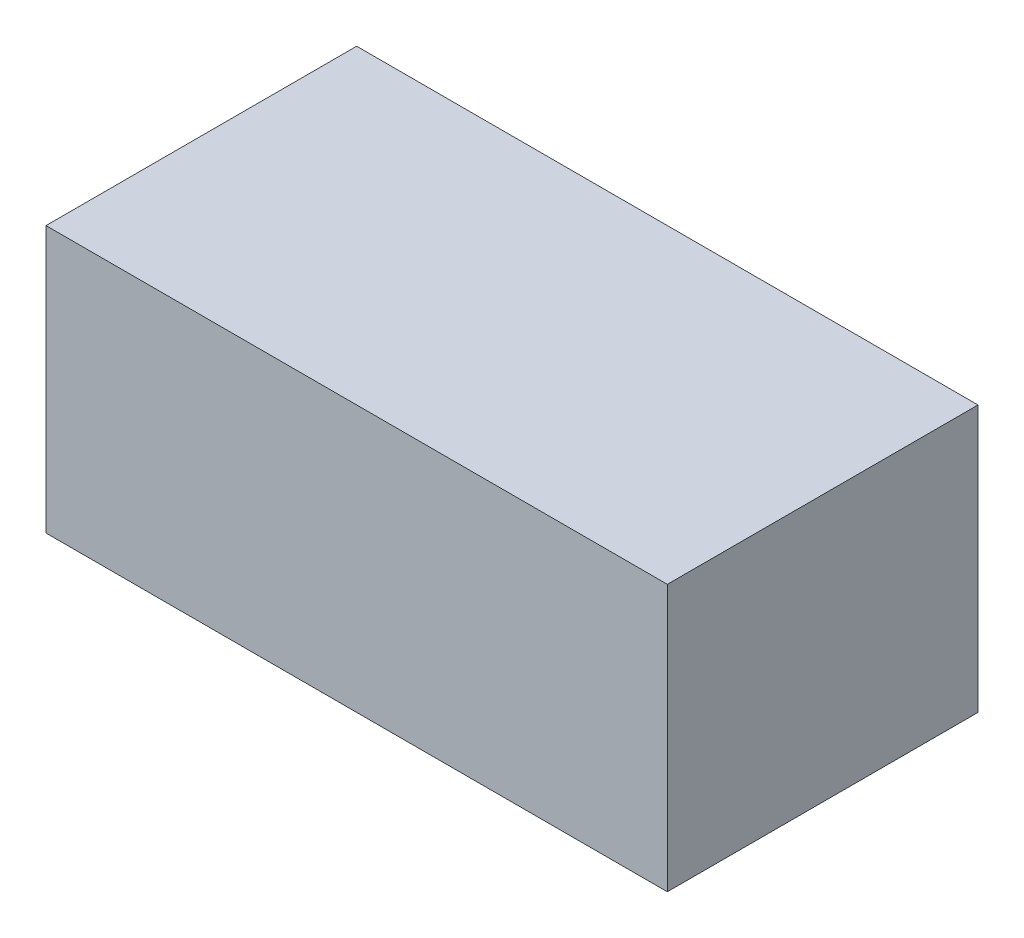
ISO-10303-21;
HEADER;
FILE_DESCRIPTION(('STEP AP214'),'2;1');
FILE_NAME('part.step','',(''),(''),'','','');
FILE_SCHEMA(('AUTOMOTIVE_DESIGN { 1 0 10303 214 1 1 1 1 }'));
ENDSEC;
DATA;
#1=APPLICATION_CONTEXT('core data for automotive mechanical design processes');
#2=APPLICATION_PROTOCOL_DEFINITION('international standard','automotive_design',2000,#1);
#3=PRODUCT_CONTEXT('',#1,'mechanical');
#4=PRODUCT('Part','Part','',(#3));
#5=PRODUCT_RELATED_PRODUCT_CATEGORY('part','',(#4));
#6=PRODUCT_DEFINITION_FORMATION('','',#4);
#7=PRODUCT_DEFINITION_CONTEXT('part definition',#1,'design');
#8=PRODUCT_DEFINITION('design','',#6,#7);
#9=PRODUCT_DEFINITION_SHAPE('','',#8);
#10=(LENGTH_UNIT() NAMED_UNIT(*) SI_UNIT(.MILLI.,.METRE.));
#11=(NAMED_UNIT(*) PLANE_ANGLE_UNIT() SI_UNIT($,.RADIAN.));
#12=(NAMED_UNIT(*) SI_UNIT($,.STERADIAN.) SOLID_ANGLE_UNIT());
#13=UNCERTAINTY_MEASURE_WITH_UNIT(LENGTH_MEASURE(1.E-05),#10,'distance_accuracy_value','');
#14=(GEOMETRIC_REPRESENTATION_CONTEXT(3) GLOBAL_UNCERTAINTY_ASSIGNED_CONTEXT((#13)) GLOBAL_UNIT_ASSIGNED_CONTEXT((#10,
#11,#12)) REPRESENTATION_CONTEXT('',''));
#15=CARTESIAN_POINT('',(0.,0.,0.));
#16=DIRECTION('',(0.,0.,1.));
#17=DIRECTION('',(1.,0.,0.));
#18=AXIS2_PLACEMENT_3D('',#15,#16,#17);
#19=CARTESIAN_POINT('',(35.,30.,-17.5));
#20=DIRECTION('',(-1.,0.,0.));
#21=DIRECTION('',(0.,0.,1.));
#22=AXIS2_PLACEMENT_3D('',#19,#20,#21);
#23=PLANE('',#22);
#24=DIRECTION('',(0.,0.,-1.));
#25=VECTOR('',#24,1.);
#26=CARTESIAN_POINT('',(35.,0.,-17.5));
#27=LINE('',#26,#25);
#28=CARTESIAN_POINT('',(35.,0.,17.5));
#29=VERTEX_POINT('',#28);
#30=CARTESIAN_POINT('',(35.,0.,-17.5));
#31=VERTEX_POINT('',#30);
#32=EDGE_CURVE('E107',#29,#31,#27,.T.);
#33=ORIENTED_EDGE('',*,*,#32,.T.);
#34=DIRECTION('',(0.,-1.,0.));
#35=VECTOR('',#34,1.);
#36=CARTESIAN_POINT('',(35.,30.,-17.5));
#37=LINE('',#36,#35);
#38=CARTESIAN_POINT('',(35.,30.,-17.5));
#39=VERTEX_POINT('',#38);
#40=EDGE_CURVE('E11',#39,#31,#37,.T.);
#41=ORIENTED_EDGE('',*,*,#40,.F.);
#42=DIRECTION('',(0.,0.,-1.));
#43=VECTOR('',#42,1.);
#44=CARTESIAN_POINT('',(35.,30.,-17.5));
#45=LINE('',#44,#43);
#46=CARTESIAN_POINT('',(35.,30.,17.5));
#47=VERTEX_POINT('',#46);
#48=EDGE_CURVE('E91',#47,#39,#45,.T.);
#49=ORIENTED_EDGE('',*,*,#48,.F.);
#50=DIRECTION('',(0.,-1.,0.));
#51=VECTOR('',#50,1.);
#52=CARTESIAN_POINT('',(35.,30.,17.5));
#53=LINE('',#52,#51);
#54=EDGE_CURVE('E103',#47,#29,#53,.T.);
#55=ORIENTED_EDGE('',*,*,#54,.T.);
#56=EDGE_LOOP('',(#33,#41,#49,#55));
#57=FACE_BOUND('',#56,.T.);
#58=ADVANCED_FACE('F39',(#57),#23,.F.);
#59=CARTESIAN_POINT('',(-35.,30.,-17.5));
#60=DIRECTION('',(0.,0.,1.));
#61=DIRECTION('',(1.,0.,0.));
#62=AXIS2_PLACEMENT_3D('',#59,#60,#61);
#63=PLANE('',#62);
#64=DIRECTION('',(-1.,0.,0.));
#65=VECTOR('',#64,1.);
#66=CARTESIAN_POINT('',(-35.,0.,-17.5));
#67=LINE('',#66,#65);
#68=CARTESIAN_POINT('',(-35.,0.,-17.5));
#69=VERTEX_POINT('',#68);
#70=EDGE_CURVE('E96',#31,#69,#67,.T.);
#71=ORIENTED_EDGE('',*,*,#70,.T.);
#72=DIRECTION('',(0.,-1.,0.));
#73=VECTOR('',#72,1.);
#74=CARTESIAN_POINT('',(-35.,30.,-17.5));
#75=LINE('',#74,#73);
#76=CARTESIAN_POINT('',(-35.,30.,-17.5));
#77=VERTEX_POINT('',#76);
#78=EDGE_CURVE('E48',#77,#69,#75,.T.);
#79=ORIENTED_EDGE('',*,*,#78,.F.);
#80=DIRECTION('',(-1.,0.,0.));
#81=VECTOR('',#80,1.);
#82=CARTESIAN_POINT('',(-35.,30.,-17.5));
#83=LINE('',#82,#81);
#84=EDGE_CURVE('E86',#39,#77,#83,.T.);
#85=ORIENTED_EDGE('',*,*,#84,.F.);
#86=ORIENTED_EDGE('',*,*,#40,.T.);
#87=EDGE_LOOP('',(#71,#79,#85,#86));
#88=FACE_BOUND('',#87,.T.);
#89=ADVANCED_FACE('F95',(#88),#63,.F.);
#90=CARTESIAN_POINT('',(-35.,30.,-17.5));
#91=DIRECTION('',(1.,0.,0.));
#92=DIRECTION('',(0.,0.,-1.));
#93=AXIS2_PLACEMENT_3D('',#90,#91,#92);
#94=PLANE('',#93);
#95=DIRECTION('',(0.,0.,1.));
#96=VECTOR('',#95,1.);
#97=CARTESIAN_POINT('',(-35.,0.,-17.5));
#98=LINE('',#97,#96);
#99=CARTESIAN_POINT('',(-35.,0.,17.5));
#100=VERTEX_POINT('',#99);
#101=EDGE_CURVE('E73',#69,#100,#98,.T.);
#102=ORIENTED_EDGE('',*,*,#101,.T.);
#103=DIRECTION('',(0.,-1.,0.));
#104=VECTOR('',#103,1.);
#105=CARTESIAN_POINT('',(-35.,30.,17.5));
#106=LINE('',#105,#104);
#107=CARTESIAN_POINT('',(-35.,30.,17.5));
#108=VERTEX_POINT('',#107);
#109=EDGE_CURVE('E98',#108,#100,#106,.T.);
#110=ORIENTED_EDGE('',*,*,#109,.F.);
#111=DIRECTION('',(0.,0.,1.));
#112=VECTOR('',#111,1.);
#113=CARTESIAN_POINT('',(-35.,30.,-17.5));
#114=LINE('',#113,#112);
#115=EDGE_CURVE('E89',#77,#108,#114,.T.);
#116=ORIENTED_EDGE('',*,*,#115,.F.);
#117=ORIENTED_EDGE('',*,*,#78,.T.);
#118=EDGE_LOOP('',(#102,#110,#116,#117));
#119=FACE_BOUND('',#118,.T.);
#120=ADVANCED_FACE('F99',(#119),#94,.F.);
#121=CARTESIAN_POINT('',(-35.,30.,17.5));
#122=DIRECTION('',(0.,0.,-1.));
#123=DIRECTION('',(-1.,0.,0.));
#124=AXIS2_PLACEMENT_3D('',#121,#122,#123);
#125=PLANE('',#124);
#126=DIRECTION('',(1.,0.,0.));
#127=VECTOR('',#126,1.);
#128=CARTESIAN_POINT('',(-35.,0.,17.5));
#129=LINE('',#128,#127);
#130=EDGE_CURVE('E79',#100,#29,#129,.T.);
#131=ORIENTED_EDGE('',*,*,#130,.T.);
#132=ORIENTED_EDGE('',*,*,#54,.F.);
#133=DIRECTION('',(1.,0.,0.));
#134=VECTOR('',#133,1.);
#135=CARTESIAN_POINT('',(-35.,30.,17.5));
#136=LINE('',#135,#134);
#137=EDGE_CURVE('E56',#108,#47,#136,.T.);
#138=ORIENTED_EDGE('',*,*,#137,.F.);
#139=ORIENTED_EDGE('',*,*,#109,.T.);
#140=EDGE_LOOP('',(#131,#132,#138,#139));
#141=FACE_BOUND('',#140,.T.);
#142=ADVANCED_FACE('F120',(#141),#125,.F.);
#143=CARTESIAN_POINT('',(0.,30.,0.));
#144=DIRECTION('',(0.,1.,0.));
#145=DIRECTION('',(0.,0.,1.));
#146=AXIS2_PLACEMENT_3D('',#143,#144,#145);
#147=PLANE('',#146);
#148=ORIENTED_EDGE('',*,*,#48,.T.);
#149=ORIENTED_EDGE('',*,*,#84,.T.);
#150=ORIENTED_EDGE('',*,*,#115,.T.);
#151=ORIENTED_EDGE('',*,*,#137,.T.);
#152=EDGE_LOOP('',(#148,#149,#150,#151));
#153=FACE_BOUND('',#152,.T.);
#154=ADVANCED_FACE('F87',(#153),#147,.T.);
#155=CARTESIAN_POINT('',(0.,0.,0.));
#156=DIRECTION('',(0.,1.,0.));
#157=DIRECTION('',(0.,0.,1.));
#158=AXIS2_PLACEMENT_3D('',#155,#156,#157);
#159=PLANE('',#158);
#160=ORIENTED_EDGE('',*,*,#32,.F.);
#161=ORIENTED_EDGE('',*,*,#130,.F.);
#162=ORIENTED_EDGE('',*,*,#101,.F.);
#163=ORIENTED_EDGE('',*,*,#70,.F.);
#164=EDGE_LOOP('',(#160,#161,#162,#163));
#165=FACE_BOUND('',#164,.T.);
#166=ADVANCED_FACE('F123',(#165),#159,.F.);
#167=CLOSED_SHELL('',(#58,#89,#120,#142,#154,#166));
#168=MANIFOLD_SOLID_BREP('B2',#167);
#169=ADVANCED_BREP_SHAPE_REPRESENTATION('',(#18,#168),#14);
#170=SHAPE_DEFINITION_REPRESENTATION(#9,#169);
ENDSEC;
END-ISO-10303-21;
